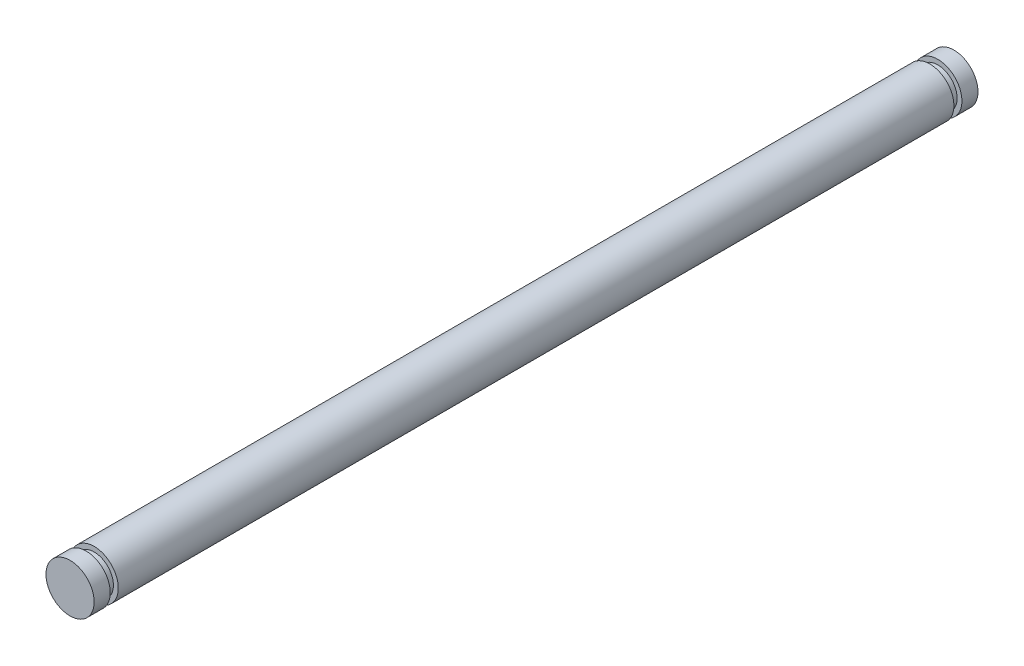
ISO-10303-21;
HEADER;
FILE_DESCRIPTION(('STEP AP214'),'2;1');
FILE_NAME('part.step','',(''),(''),'','','');
FILE_SCHEMA(('AUTOMOTIVE_DESIGN { 1 0 10303 214 1 1 1 1 }'));
ENDSEC;
DATA;
#1=APPLICATION_CONTEXT('core data for automotive mechanical design processes');
#2=APPLICATION_PROTOCOL_DEFINITION('international standard','automotive_design',2000,#1);
#3=PRODUCT_CONTEXT('',#1,'mechanical');
#4=PRODUCT('Part','Part','',(#3));
#5=PRODUCT_RELATED_PRODUCT_CATEGORY('part','',(#4));
#6=PRODUCT_DEFINITION_FORMATION('','',#4);
#7=PRODUCT_DEFINITION_CONTEXT('part definition',#1,'design');
#8=PRODUCT_DEFINITION('design','',#6,#7);
#9=PRODUCT_DEFINITION_SHAPE('','',#8);
#10=(LENGTH_UNIT() NAMED_UNIT(*) SI_UNIT(.MILLI.,.METRE.));
#11=(NAMED_UNIT(*) PLANE_ANGLE_UNIT() SI_UNIT($,.RADIAN.));
#12=(NAMED_UNIT(*) SI_UNIT($,.STERADIAN.) SOLID_ANGLE_UNIT());
#13=UNCERTAINTY_MEASURE_WITH_UNIT(LENGTH_MEASURE(1.E-05),#10,'distance_accuracy_value','');
#14=(GEOMETRIC_REPRESENTATION_CONTEXT(3) GLOBAL_UNCERTAINTY_ASSIGNED_CONTEXT((#13)) GLOBAL_UNIT_ASSIGNED_CONTEXT((#10,
#11,#12)) REPRESENTATION_CONTEXT('',''));
#15=CARTESIAN_POINT('',(0.,0.,0.));
#16=DIRECTION('',(0.,0.,1.));
#17=DIRECTION('',(1.,0.,0.));
#18=AXIS2_PLACEMENT_3D('',#15,#16,#17);
#19=CARTESIAN_POINT('',(0.,0.,55.));
#20=DIRECTION('',(0.,0.,-1.));
#21=DIRECTION('',(-1.,0.,0.));
#22=AXIS2_PLACEMENT_3D('',#19,#20,#21);
#23=CYLINDRICAL_SURFACE('',#22,1.5);
#24=CARTESIAN_POINT('',(0.,0.,53.5));
#25=DIRECTION('',(0.,0.,-1.));
#26=DIRECTION('',(-1.,0.,0.));
#27=AXIS2_PLACEMENT_3D('',#24,#25,#26);
#28=CIRCLE('',#27,1.5);
#29=CARTESIAN_POINT('',(-1.5,0.,53.5));
#30=VERTEX_POINT('',#29);
#31=EDGE_CURVE('E50',#30,#30,#28,.T.);
#32=ORIENTED_EDGE('',*,*,#31,.T.);
#33=EDGE_LOOP('',(#32));
#34=FACE_BOUND('',#33,.T.);
#35=CARTESIAN_POINT('',(0.,0.,1.5));
#36=DIRECTION('',(0.,0.,1.));
#37=DIRECTION('',(1.,0.,0.));
#38=AXIS2_PLACEMENT_3D('',#35,#36,#37);
#39=CIRCLE('',#38,1.5);
#40=CARTESIAN_POINT('',(1.5,0.,1.5));
#41=VERTEX_POINT('',#40);
#42=EDGE_CURVE('E59',#41,#41,#39,.T.);
#43=ORIENTED_EDGE('',*,*,#42,.T.);
#44=EDGE_LOOP('',(#43));
#45=FACE_BOUND('',#44,.T.);
#46=ADVANCED_FACE('F46',(#34,#45),#23,.T.);
#47=CARTESIAN_POINT('',(-1.2,0.,1.5));
#48=DIRECTION('',(0.,0.,1.));
#49=DIRECTION('',(1.,0.,0.));
#50=AXIS2_PLACEMENT_3D('',#47,#48,#49);
#51=PLANE('',#50);
#52=CARTESIAN_POINT('',(0.,0.,1.5));
#53=DIRECTION('',(0.,0.,-1.));
#54=DIRECTION('',(-1.,0.,0.));
#55=AXIS2_PLACEMENT_3D('',#52,#53,#54);
#56=CIRCLE('',#55,1.2);
#57=CARTESIAN_POINT('',(-1.2,0.,1.5));
#58=VERTEX_POINT('',#57);
#59=EDGE_CURVE('E62',#58,#58,#56,.T.);
#60=ORIENTED_EDGE('',*,*,#59,.F.);
#61=EDGE_LOOP('',(#60));
#62=FACE_BOUND('',#61,.T.);
#63=ORIENTED_EDGE('',*,*,#42,.F.);
#64=EDGE_LOOP('',(#63));
#65=FACE_BOUND('',#64,.T.);
#66=ADVANCED_FACE('F91',(#62,#65),#51,.F.);
#67=CARTESIAN_POINT('',(-1.2,0.,1.));
#68=DIRECTION('',(0.,0.,-1.));
#69=DIRECTION('',(-1.,0.,0.));
#70=AXIS2_PLACEMENT_3D('',#67,#68,#69);
#71=PLANE('',#70);
#72=CARTESIAN_POINT('',(0.,0.,1.));
#73=DIRECTION('',(0.,0.,-1.));
#74=DIRECTION('',(-1.,0.,0.));
#75=AXIS2_PLACEMENT_3D('',#72,#73,#74);
#76=CIRCLE('',#75,1.2);
#77=CARTESIAN_POINT('',(-1.2,0.,1.));
#78=VERTEX_POINT('',#77);
#79=EDGE_CURVE('E75',#78,#78,#76,.T.);
#80=ORIENTED_EDGE('',*,*,#79,.T.);
#81=EDGE_LOOP('',(#80));
#82=FACE_BOUND('',#81,.T.);
#83=CARTESIAN_POINT('',(0.,0.,1.));
#84=DIRECTION('',(0.,0.,-1.));
#85=DIRECTION('',(-1.,0.,0.));
#86=AXIS2_PLACEMENT_3D('',#83,#84,#85);
#87=CIRCLE('',#86,1.5);
#88=CARTESIAN_POINT('',(-1.5,0.,1.));
#89=VERTEX_POINT('',#88);
#90=EDGE_CURVE('E65',#89,#89,#87,.T.);
#91=ORIENTED_EDGE('',*,*,#90,.F.);
#92=EDGE_LOOP('',(#91));
#93=FACE_BOUND('',#92,.T.);
#94=ADVANCED_FACE('F94',(#82,#93),#71,.F.);
#95=CARTESIAN_POINT('',(0.,0.,0.));
#96=DIRECTION('',(0.,0.,-1.));
#97=DIRECTION('',(-1.,0.,0.));
#98=AXIS2_PLACEMENT_3D('',#95,#96,#97);
#99=CYLINDRICAL_SURFACE('',#98,1.2);
#100=ORIENTED_EDGE('',*,*,#79,.F.);
#101=EDGE_LOOP('',(#100));
#102=FACE_BOUND('',#101,.T.);
#103=ORIENTED_EDGE('',*,*,#59,.T.);
#104=EDGE_LOOP('',(#103));
#105=FACE_BOUND('',#104,.T.);
#106=ADVANCED_FACE('F89',(#102,#105),#99,.T.);
#107=CARTESIAN_POINT('',(0.,0.,0.));
#108=DIRECTION('',(0.,0.,1.));
#109=DIRECTION('',(1.,0.,0.));
#110=AXIS2_PLACEMENT_3D('',#107,#108,#109);
#111=PLANE('',#110);
#112=CARTESIAN_POINT('',(0.,0.,0.));
#113=DIRECTION('',(0.,0.,1.));
#114=DIRECTION('',(1.,0.,0.));
#115=AXIS2_PLACEMENT_3D('',#112,#113,#114);
#116=CIRCLE('',#115,1.5);
#117=CARTESIAN_POINT('',(1.5,0.,0.));
#118=VERTEX_POINT('',#117);
#119=EDGE_CURVE('E54',#118,#118,#116,.T.);
#120=ORIENTED_EDGE('',*,*,#119,.F.);
#121=EDGE_LOOP('',(#120));
#122=FACE_BOUND('',#121,.T.);
#123=ADVANCED_FACE('F107',(#122),#111,.F.);
#124=ORIENTED_EDGE('',*,*,#90,.T.);
#125=EDGE_LOOP('',(#124));
#126=FACE_BOUND('',#125,.T.);
#127=ORIENTED_EDGE('',*,*,#119,.T.);
#128=EDGE_LOOP('',(#127));
#129=FACE_BOUND('',#128,.T.);
#130=ADVANCED_FACE('F48',(#126,#129),#23,.T.);
#131=CARTESIAN_POINT('',(-1.2,0.,53.5));
#132=DIRECTION('',(0.,0.,-1.));
#133=DIRECTION('',(1.,0.,0.));
#134=AXIS2_PLACEMENT_3D('',#131,#132,#133);
#135=PLANE('',#134);
#136=CARTESIAN_POINT('',(0.,0.,53.5));
#137=DIRECTION('',(0.,0.,-1.));
#138=DIRECTION('',(-1.,0.,0.));
#139=AXIS2_PLACEMENT_3D('',#136,#137,#138);
#140=CIRCLE('',#139,1.2);
#141=CARTESIAN_POINT('',(-1.2,0.,53.5));
#142=VERTEX_POINT('',#141);
#143=EDGE_CURVE('E71',#142,#142,#140,.T.);
#144=ORIENTED_EDGE('',*,*,#143,.T.);
#145=EDGE_LOOP('',(#144));
#146=FACE_BOUND('',#145,.T.);
#147=ORIENTED_EDGE('',*,*,#31,.F.);
#148=EDGE_LOOP('',(#147));
#149=FACE_BOUND('',#148,.T.);
#150=ADVANCED_FACE('F106',(#146,#149),#135,.F.);
#151=CARTESIAN_POINT('',(-1.2,0.,54.));
#152=DIRECTION('',(0.,0.,1.));
#153=DIRECTION('',(-1.,0.,0.));
#154=AXIS2_PLACEMENT_3D('',#151,#152,#153);
#155=PLANE('',#154);
#156=CARTESIAN_POINT('',(0.,0.,54.));
#157=DIRECTION('',(0.,0.,-1.));
#158=DIRECTION('',(-1.,0.,0.));
#159=AXIS2_PLACEMENT_3D('',#156,#157,#158);
#160=CIRCLE('',#159,1.2);
#161=CARTESIAN_POINT('',(-1.2,0.,54.));
#162=VERTEX_POINT('',#161);
#163=EDGE_CURVE('E77',#162,#162,#160,.T.);
#164=ORIENTED_EDGE('',*,*,#163,.F.);
#165=EDGE_LOOP('',(#164));
#166=FACE_BOUND('',#165,.T.);
#167=CARTESIAN_POINT('',(0.,0.,54.));
#168=DIRECTION('',(0.,0.,1.));
#169=DIRECTION('',(1.,0.,0.));
#170=AXIS2_PLACEMENT_3D('',#167,#168,#169);
#171=CIRCLE('',#170,1.5);
#172=CARTESIAN_POINT('',(1.5,0.,54.));
#173=VERTEX_POINT('',#172);
#174=EDGE_CURVE('E69',#173,#173,#171,.T.);
#175=ORIENTED_EDGE('',*,*,#174,.F.);
#176=EDGE_LOOP('',(#175));
#177=FACE_BOUND('',#176,.T.);
#178=ADVANCED_FACE('F113',(#166,#177),#155,.F.);
#179=CARTESIAN_POINT('',(0.,0.,55.));
#180=DIRECTION('',(0.,0.,1.));
#181=DIRECTION('',(-1.,0.,0.));
#182=AXIS2_PLACEMENT_3D('',#179,#180,#181);
#183=CYLINDRICAL_SURFACE('',#182,1.2);
#184=ORIENTED_EDGE('',*,*,#163,.T.);
#185=EDGE_LOOP('',(#184));
#186=FACE_BOUND('',#185,.T.);
#187=ORIENTED_EDGE('',*,*,#143,.F.);
#188=EDGE_LOOP('',(#187));
#189=FACE_BOUND('',#188,.T.);
#190=ADVANCED_FACE('F128',(#186,#189),#183,.T.);
#191=CARTESIAN_POINT('',(0.,0.,55.));
#192=DIRECTION('',(0.,0.,1.));
#193=DIRECTION('',(1.,0.,0.));
#194=AXIS2_PLACEMENT_3D('',#191,#192,#193);
#195=PLANE('',#194);
#196=CARTESIAN_POINT('',(0.,0.,55.));
#197=DIRECTION('',(0.,0.,1.));
#198=DIRECTION('',(1.,0.,0.));
#199=AXIS2_PLACEMENT_3D('',#196,#197,#198);
#200=CIRCLE('',#199,1.5);
#201=CARTESIAN_POINT('',(1.5,0.,55.));
#202=VERTEX_POINT('',#201);
#203=EDGE_CURVE('E12',#202,#202,#200,.T.);
#204=ORIENTED_EDGE('',*,*,#203,.T.);
#205=EDGE_LOOP('',(#204));
#206=FACE_BOUND('',#205,.T.);
#207=ADVANCED_FACE('F104',(#206),#195,.T.);
#208=ORIENTED_EDGE('',*,*,#174,.T.);
#209=EDGE_LOOP('',(#208));
#210=FACE_BOUND('',#209,.T.);
#211=ORIENTED_EDGE('',*,*,#203,.F.);
#212=EDGE_LOOP('',(#211));
#213=FACE_BOUND('',#212,.T.);
#214=ADVANCED_FACE('F100',(#210,#213),#23,.T.);
#215=CLOSED_SHELL('',(#46,#66,#94,#106,#123,#130,#150,#178,#190,#207,#214));
#216=MANIFOLD_SOLID_BREP('B2',#215);
#217=ADVANCED_BREP_SHAPE_REPRESENTATION('',(#18,#216),#14);
#218=SHAPE_DEFINITION_REPRESENTATION(#9,#217);
ENDSEC;
END-ISO-10303-21;
